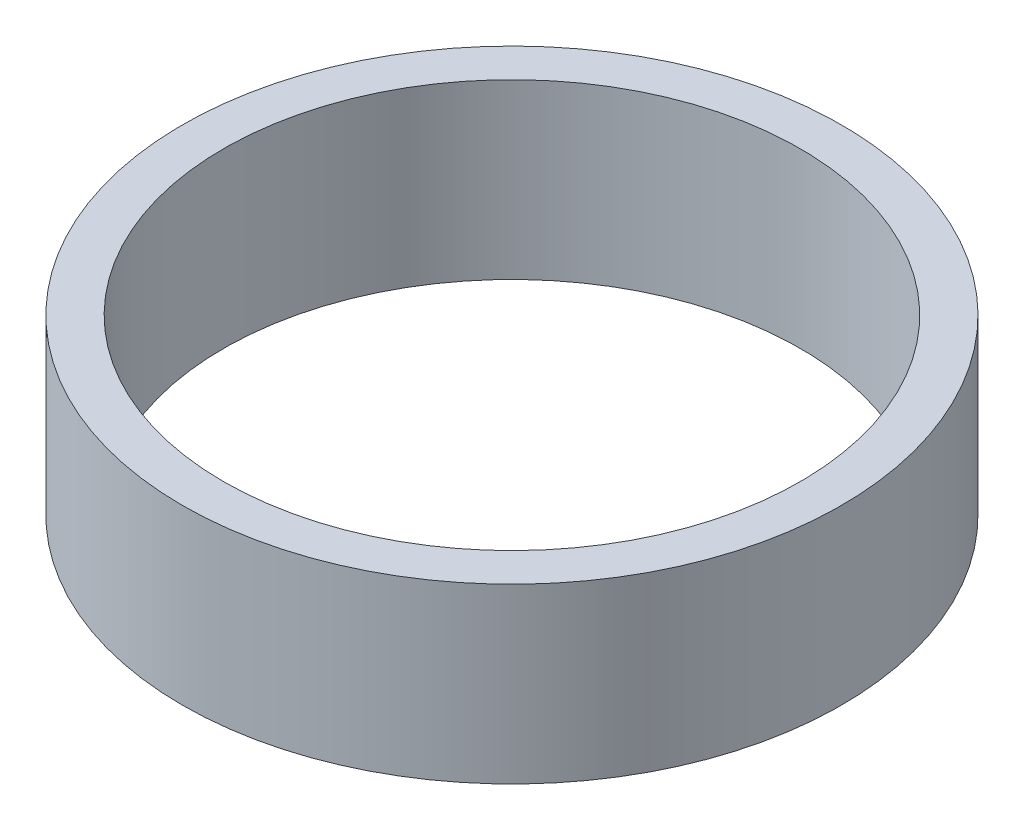
ISO-10303-21;
HEADER;
FILE_DESCRIPTION(('STEP AP214'),'2;1');
FILE_NAME('part.step','',(''),(''),'','','');
FILE_SCHEMA(('AUTOMOTIVE_DESIGN { 1 0 10303 214 1 1 1 1 }'));
ENDSEC;
DATA;
#1=APPLICATION_CONTEXT('core data for automotive mechanical design processes');
#2=APPLICATION_PROTOCOL_DEFINITION('international standard','automotive_design',2000,#1);
#3=PRODUCT_CONTEXT('',#1,'mechanical');
#4=PRODUCT('Part','Part','',(#3));
#5=PRODUCT_RELATED_PRODUCT_CATEGORY('part','',(#4));
#6=PRODUCT_DEFINITION_FORMATION('','',#4);
#7=PRODUCT_DEFINITION_CONTEXT('part definition',#1,'design');
#8=PRODUCT_DEFINITION('design','',#6,#7);
#9=PRODUCT_DEFINITION_SHAPE('','',#8);
#10=(LENGTH_UNIT() NAMED_UNIT(*) SI_UNIT(.MILLI.,.METRE.));
#11=(NAMED_UNIT(*) PLANE_ANGLE_UNIT() SI_UNIT($,.RADIAN.));
#12=(NAMED_UNIT(*) SI_UNIT($,.STERADIAN.) SOLID_ANGLE_UNIT());
#13=UNCERTAINTY_MEASURE_WITH_UNIT(LENGTH_MEASURE(1.E-05),#10,'distance_accuracy_value','');
#14=(GEOMETRIC_REPRESENTATION_CONTEXT(3) GLOBAL_UNCERTAINTY_ASSIGNED_CONTEXT((#13)) GLOBAL_UNIT_ASSIGNED_CONTEXT((#10,
#11,#12)) REPRESENTATION_CONTEXT('',''));
#15=CARTESIAN_POINT('',(0.,0.,0.));
#16=DIRECTION('',(0.,0.,1.));
#17=DIRECTION('',(1.,0.,0.));
#18=AXIS2_PLACEMENT_3D('',#15,#16,#17);
#19=CARTESIAN_POINT('',(0.,21.,0.));
#20=DIRECTION('',(0.,1.,0.));
#21=DIRECTION('',(0.,0.,1.));
#22=AXIS2_PLACEMENT_3D('',#19,#20,#21);
#23=PLANE('',#22);
#24=CARTESIAN_POINT('',(0.,21.,0.));
#25=DIRECTION('',(0.,1.,0.));
#26=DIRECTION('',(0.,0.,1.));
#27=AXIS2_PLACEMENT_3D('',#24,#25,#26);
#28=CIRCLE('',#27,40.);
#29=CARTESIAN_POINT('',(0.,21.,40.));
#30=VERTEX_POINT('',#29);
#31=EDGE_CURVE('E10',#30,#30,#28,.T.);
#32=ORIENTED_EDGE('',*,*,#31,.T.);
#33=EDGE_LOOP('',(#32));
#34=FACE_BOUND('',#33,.T.);
#35=CARTESIAN_POINT('',(0.,21.,0.));
#36=DIRECTION('',(0.,1.,0.));
#37=DIRECTION('',(0.,0.,1.));
#38=AXIS2_PLACEMENT_3D('',#35,#36,#37);
#39=CIRCLE('',#38,35.);
#40=CARTESIAN_POINT('',(0.,21.,35.));
#41=VERTEX_POINT('',#40);
#42=EDGE_CURVE('E53',#41,#41,#39,.T.);
#43=ORIENTED_EDGE('',*,*,#42,.F.);
#44=EDGE_LOOP('',(#43));
#45=FACE_BOUND('',#44,.T.);
#46=ADVANCED_FACE('F39',(#34,#45),#23,.T.);
#47=CARTESIAN_POINT('',(0.,0.,0.));
#48=DIRECTION('',(0.,1.,0.));
#49=DIRECTION('',(0.,0.,1.));
#50=AXIS2_PLACEMENT_3D('',#47,#48,#49);
#51=PLANE('',#50);
#52=CARTESIAN_POINT('',(0.,0.,0.));
#53=DIRECTION('',(0.,1.,0.));
#54=DIRECTION('',(0.,0.,1.));
#55=AXIS2_PLACEMENT_3D('',#52,#53,#54);
#56=CIRCLE('',#55,40.);
#57=CARTESIAN_POINT('',(0.,0.,40.));
#58=VERTEX_POINT('',#57);
#59=EDGE_CURVE('E43',#58,#58,#56,.T.);
#60=ORIENTED_EDGE('',*,*,#59,.F.);
#61=EDGE_LOOP('',(#60));
#62=FACE_BOUND('',#61,.T.);
#63=CARTESIAN_POINT('',(0.,0.,0.));
#64=DIRECTION('',(0.,1.,0.));
#65=DIRECTION('',(0.,0.,1.));
#66=AXIS2_PLACEMENT_3D('',#63,#64,#65);
#67=CIRCLE('',#66,35.);
#68=CARTESIAN_POINT('',(0.,0.,35.));
#69=VERTEX_POINT('',#68);
#70=EDGE_CURVE('E55',#69,#69,#67,.T.);
#71=ORIENTED_EDGE('',*,*,#70,.T.);
#72=EDGE_LOOP('',(#71));
#73=FACE_BOUND('',#72,.T.);
#74=ADVANCED_FACE('F68',(#62,#73),#51,.F.);
#75=CARTESIAN_POINT('',(0.,21.,0.));
#76=DIRECTION('',(0.,-1.,0.));
#77=DIRECTION('',(0.,0.,-1.));
#78=AXIS2_PLACEMENT_3D('',#75,#76,#77);
#79=CYLINDRICAL_SURFACE('',#78,40.);
#80=ORIENTED_EDGE('',*,*,#31,.F.);
#81=EDGE_LOOP('',(#80));
#82=FACE_BOUND('',#81,.T.);
#83=ORIENTED_EDGE('',*,*,#59,.T.);
#84=EDGE_LOOP('',(#83));
#85=FACE_BOUND('',#84,.T.);
#86=ADVANCED_FACE('F41',(#82,#85),#79,.T.);
#87=CARTESIAN_POINT('',(0.,21.,0.));
#88=DIRECTION('',(0.,-1.,0.));
#89=DIRECTION('',(0.,0.,-1.));
#90=AXIS2_PLACEMENT_3D('',#87,#88,#89);
#91=CYLINDRICAL_SURFACE('',#90,35.);
#92=ORIENTED_EDGE('',*,*,#42,.T.);
#93=EDGE_LOOP('',(#92));
#94=FACE_BOUND('',#93,.T.);
#95=ORIENTED_EDGE('',*,*,#70,.F.);
#96=EDGE_LOOP('',(#95));
#97=FACE_BOUND('',#96,.T.);
#98=ADVANCED_FACE('F64',(#94,#97),#91,.F.);
#99=CLOSED_SHELL('',(#46,#74,#86,#98));
#100=MANIFOLD_SOLID_BREP('B2',#99);
#101=ADVANCED_BREP_SHAPE_REPRESENTATION('',(#18,#100),#14);
#102=SHAPE_DEFINITION_REPRESENTATION(#9,#101);
ENDSEC;
END-ISO-10303-21;
